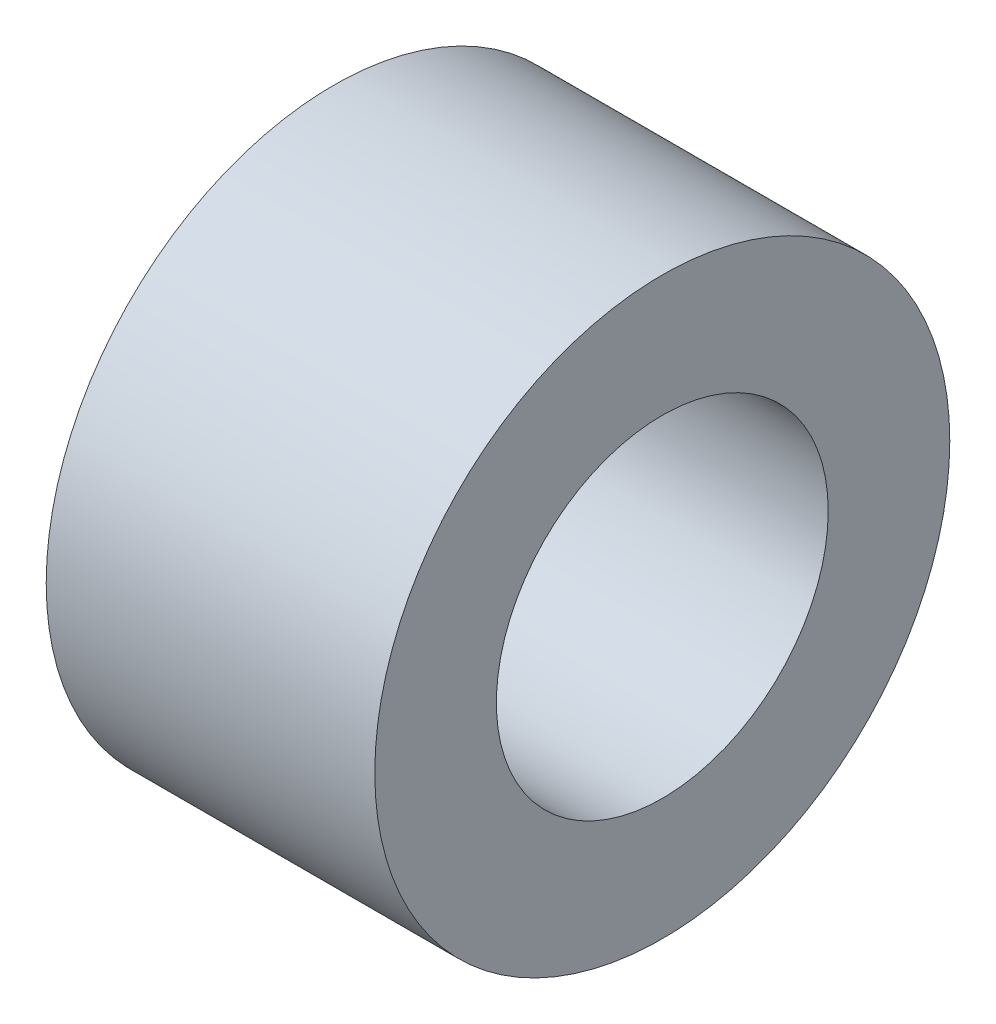
ISO-10303-21;
HEADER;
FILE_DESCRIPTION(('STEP AP214'),'2;1');
FILE_NAME('part.step','',(''),(''),'','','');
FILE_SCHEMA(('AUTOMOTIVE_DESIGN { 1 0 10303 214 1 1 1 1 }'));
ENDSEC;
DATA;
#1=APPLICATION_CONTEXT('core data for automotive mechanical design processes');
#2=APPLICATION_PROTOCOL_DEFINITION('international standard','automotive_design',2000,#1);
#3=PRODUCT_CONTEXT('',#1,'mechanical');
#4=PRODUCT('Part','Part','',(#3));
#5=PRODUCT_RELATED_PRODUCT_CATEGORY('part','',(#4));
#6=PRODUCT_DEFINITION_FORMATION('','',#4);
#7=PRODUCT_DEFINITION_CONTEXT('part definition',#1,'design');
#8=PRODUCT_DEFINITION('design','',#6,#7);
#9=PRODUCT_DEFINITION_SHAPE('','',#8);
#10=(LENGTH_UNIT() NAMED_UNIT(*) SI_UNIT(.MILLI.,.METRE.));
#11=(NAMED_UNIT(*) PLANE_ANGLE_UNIT() SI_UNIT($,.RADIAN.));
#12=(NAMED_UNIT(*) SI_UNIT($,.STERADIAN.) SOLID_ANGLE_UNIT());
#13=UNCERTAINTY_MEASURE_WITH_UNIT(LENGTH_MEASURE(1.E-05),#10,'distance_accuracy_value','');
#14=(GEOMETRIC_REPRESENTATION_CONTEXT(3) GLOBAL_UNCERTAINTY_ASSIGNED_CONTEXT((#13)) GLOBAL_UNIT_ASSIGNED_CONTEXT((#10,
#11,#12)) REPRESENTATION_CONTEXT('',''));
#15=CARTESIAN_POINT('',(0.,0.,0.));
#16=DIRECTION('',(0.,0.,1.));
#17=DIRECTION('',(1.,0.,0.));
#18=AXIS2_PLACEMENT_3D('',#15,#16,#17);
#19=CARTESIAN_POINT('',(12.7,0.,0.));
#20=DIRECTION('',(1.,0.,0.));
#21=DIRECTION('',(0.,0.,-1.));
#22=AXIS2_PLACEMENT_3D('',#19,#20,#21);
#23=PLANE('',#22);
#24=CARTESIAN_POINT('',(12.7,0.,0.));
#25=DIRECTION('',(1.,0.,0.));
#26=DIRECTION('',(0.,0.,-1.));
#27=AXIS2_PLACEMENT_3D('',#24,#25,#26);
#28=CIRCLE('',#27,11.1125);
#29=CARTESIAN_POINT('',(12.7,0.,-11.1125));
#30=VERTEX_POINT('',#29);
#31=EDGE_CURVE('E10',#30,#30,#28,.T.);
#32=ORIENTED_EDGE('',*,*,#31,.T.);
#33=EDGE_LOOP('',(#32));
#34=FACE_BOUND('',#33,.T.);
#35=CARTESIAN_POINT('',(12.7,0.,0.));
#36=DIRECTION('',(1.,0.,0.));
#37=DIRECTION('',(0.,0.,-1.));
#38=AXIS2_PLACEMENT_3D('',#35,#36,#37);
#39=CIRCLE('',#38,6.4135);
#40=CARTESIAN_POINT('',(12.7,0.,-6.4135));
#41=VERTEX_POINT('',#40);
#42=EDGE_CURVE('E50',#41,#41,#39,.T.);
#43=ORIENTED_EDGE('',*,*,#42,.F.);
#44=EDGE_LOOP('',(#43));
#45=FACE_BOUND('',#44,.T.);
#46=ADVANCED_FACE('F39',(#34,#45),#23,.T.);
#47=CARTESIAN_POINT('',(0.,0.,0.));
#48=DIRECTION('',(1.,0.,0.));
#49=DIRECTION('',(0.,0.,-1.));
#50=AXIS2_PLACEMENT_3D('',#47,#48,#49);
#51=PLANE('',#50);
#52=CARTESIAN_POINT('',(0.,0.,0.));
#53=DIRECTION('',(1.,0.,0.));
#54=DIRECTION('',(0.,0.,-1.));
#55=AXIS2_PLACEMENT_3D('',#52,#53,#54);
#56=CIRCLE('',#55,11.1125);
#57=CARTESIAN_POINT('',(0.,0.,-11.1125));
#58=VERTEX_POINT('',#57);
#59=EDGE_CURVE('E43',#58,#58,#56,.T.);
#60=ORIENTED_EDGE('',*,*,#59,.F.);
#61=EDGE_LOOP('',(#60));
#62=FACE_BOUND('',#61,.T.);
#63=CARTESIAN_POINT('',(0.,0.,0.));
#64=DIRECTION('',(1.,0.,0.));
#65=DIRECTION('',(0.,0.,-1.));
#66=AXIS2_PLACEMENT_3D('',#63,#64,#65);
#67=CIRCLE('',#66,6.4135);
#68=CARTESIAN_POINT('',(0.,0.,-6.4135));
#69=VERTEX_POINT('',#68);
#70=EDGE_CURVE('E52',#69,#69,#67,.T.);
#71=ORIENTED_EDGE('',*,*,#70,.T.);
#72=EDGE_LOOP('',(#71));
#73=FACE_BOUND('',#72,.T.);
#74=ADVANCED_FACE('F62',(#62,#73),#51,.F.);
#75=CARTESIAN_POINT('',(12.7,0.,0.));
#76=DIRECTION('',(-1.,0.,0.));
#77=DIRECTION('',(0.,0.,1.));
#78=AXIS2_PLACEMENT_3D('',#75,#76,#77);
#79=CYLINDRICAL_SURFACE('',#78,11.1125);
#80=ORIENTED_EDGE('',*,*,#31,.F.);
#81=EDGE_LOOP('',(#80));
#82=FACE_BOUND('',#81,.T.);
#83=ORIENTED_EDGE('',*,*,#59,.T.);
#84=EDGE_LOOP('',(#83));
#85=FACE_BOUND('',#84,.T.);
#86=ADVANCED_FACE('F41',(#82,#85),#79,.T.);
#87=CARTESIAN_POINT('',(12.7,0.,0.));
#88=DIRECTION('',(-1.,0.,0.));
#89=DIRECTION('',(0.,0.,1.));
#90=AXIS2_PLACEMENT_3D('',#87,#88,#89);
#91=CYLINDRICAL_SURFACE('',#90,6.4135);
#92=ORIENTED_EDGE('',*,*,#42,.T.);
#93=EDGE_LOOP('',(#92));
#94=FACE_BOUND('',#93,.T.);
#95=ORIENTED_EDGE('',*,*,#70,.F.);
#96=EDGE_LOOP('',(#95));
#97=FACE_BOUND('',#96,.T.);
#98=ADVANCED_FACE('F58',(#94,#97),#91,.F.);
#99=CLOSED_SHELL('',(#46,#74,#86,#98));
#100=MANIFOLD_SOLID_BREP('B2',#99);
#101=ADVANCED_BREP_SHAPE_REPRESENTATION('',(#18,#100),#14);
#102=SHAPE_DEFINITION_REPRESENTATION(#9,#101);
ENDSEC;
END-ISO-10303-21;
